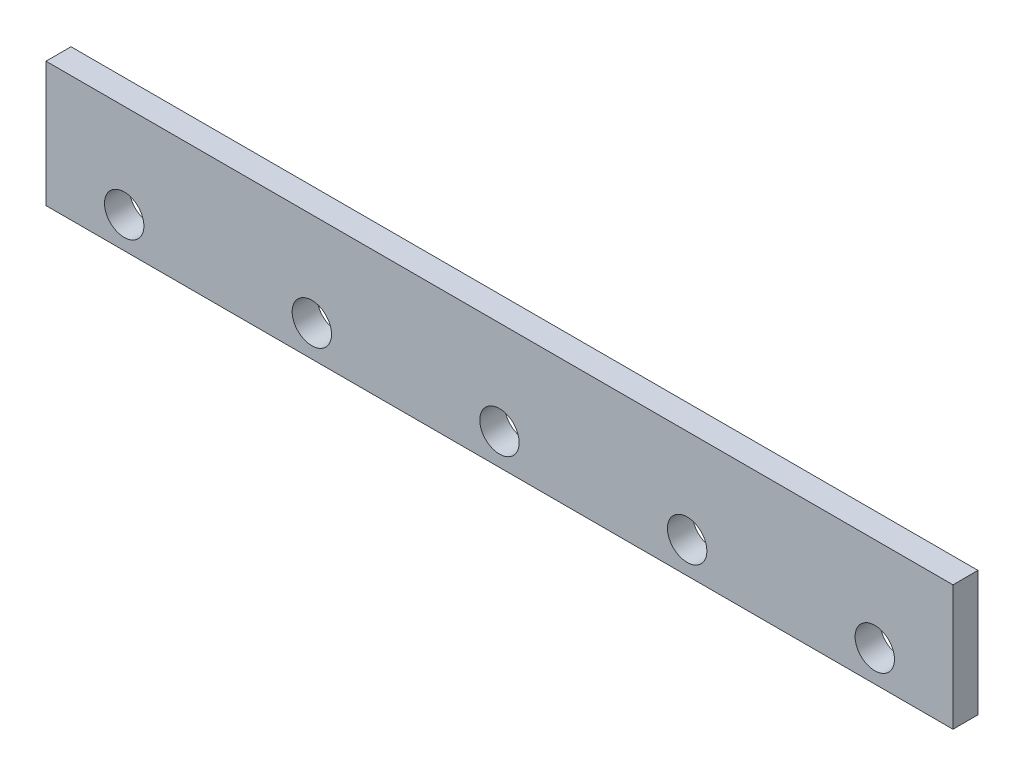
ISO-10303-21;
HEADER;
FILE_DESCRIPTION(('STEP AP214'),'2;1');
FILE_NAME('part.step','',(''),(''),'','','');
FILE_SCHEMA(('AUTOMOTIVE_DESIGN { 1 0 10303 214 1 1 1 1 }'));
ENDSEC;
DATA;
#1=APPLICATION_CONTEXT('core data for automotive mechanical design processes');
#2=APPLICATION_PROTOCOL_DEFINITION('international standard','automotive_design',2000,#1);
#3=PRODUCT_CONTEXT('',#1,'mechanical');
#4=PRODUCT('Part','Part','',(#3));
#5=PRODUCT_RELATED_PRODUCT_CATEGORY('part','',(#4));
#6=PRODUCT_DEFINITION_FORMATION('','',#4);
#7=PRODUCT_DEFINITION_CONTEXT('part definition',#1,'design');
#8=PRODUCT_DEFINITION('design','',#6,#7);
#9=PRODUCT_DEFINITION_SHAPE('','',#8);
#10=(LENGTH_UNIT() NAMED_UNIT(*) SI_UNIT(.MILLI.,.METRE.));
#11=(NAMED_UNIT(*) PLANE_ANGLE_UNIT() SI_UNIT($,.RADIAN.));
#12=(NAMED_UNIT(*) SI_UNIT($,.STERADIAN.) SOLID_ANGLE_UNIT());
#13=UNCERTAINTY_MEASURE_WITH_UNIT(LENGTH_MEASURE(1.E-05),#10,'distance_accuracy_value','');
#14=(GEOMETRIC_REPRESENTATION_CONTEXT(3) GLOBAL_UNCERTAINTY_ASSIGNED_CONTEXT((#13)) GLOBAL_UNIT_ASSIGNED_CONTEXT((#10,
#11,#12)) REPRESENTATION_CONTEXT('',''));
#15=CARTESIAN_POINT('',(0.,0.,0.));
#16=DIRECTION('',(0.,0.,1.));
#17=DIRECTION('',(1.,0.,0.));
#18=AXIS2_PLACEMENT_3D('',#15,#16,#17);
#19=CARTESIAN_POINT('',(530.,20.,-8.));
#20=DIRECTION('',(0.,0.,1.));
#21=DIRECTION('',(1.,0.,0.));
#22=AXIS2_PLACEMENT_3D('',#19,#20,#21);
#23=CYLINDRICAL_SURFACE('',#22,12.6);
#24=CARTESIAN_POINT('',(530.,20.,-8.));
#25=DIRECTION('',(0.,0.,1.));
#26=DIRECTION('',(1.,0.,0.));
#27=AXIS2_PLACEMENT_3D('',#24,#25,#26);
#28=CIRCLE('',#27,12.6);
#29=CARTESIAN_POINT('',(542.6,20.,-8.));
#30=VERTEX_POINT('',#29);
#31=EDGE_CURVE('E42',#30,#30,#28,.T.);
#32=ORIENTED_EDGE('',*,*,#31,.F.);
#33=EDGE_LOOP('',(#32));
#34=FACE_BOUND('',#33,.T.);
#35=CARTESIAN_POINT('',(530.,20.,8.));
#36=DIRECTION('',(0.,0.,1.));
#37=DIRECTION('',(1.,0.,0.));
#38=AXIS2_PLACEMENT_3D('',#35,#36,#37);
#39=CIRCLE('',#38,12.6);
#40=CARTESIAN_POINT('',(542.6,20.,8.));
#41=VERTEX_POINT('',#40);
#42=EDGE_CURVE('E11',#41,#41,#39,.T.);
#43=ORIENTED_EDGE('',*,*,#42,.T.);
#44=EDGE_LOOP('',(#43));
#45=FACE_BOUND('',#44,.T.);
#46=ADVANCED_FACE('F35',(#34,#45),#23,.F.);
#47=CARTESIAN_POINT('',(410.,20.,-8.));
#48=DIRECTION('',(0.,0.,1.));
#49=DIRECTION('',(1.,0.,0.));
#50=AXIS2_PLACEMENT_3D('',#47,#48,#49);
#51=CYLINDRICAL_SURFACE('',#50,12.6);
#52=CARTESIAN_POINT('',(410.,20.,-8.));
#53=DIRECTION('',(0.,0.,1.));
#54=DIRECTION('',(1.,0.,0.));
#55=AXIS2_PLACEMENT_3D('',#52,#53,#54);
#56=CIRCLE('',#55,12.6);
#57=CARTESIAN_POINT('',(422.6,20.,-8.));
#58=VERTEX_POINT('',#57);
#59=EDGE_CURVE('E122',#58,#58,#56,.T.);
#60=ORIENTED_EDGE('',*,*,#59,.F.);
#61=EDGE_LOOP('',(#60));
#62=FACE_BOUND('',#61,.T.);
#63=CARTESIAN_POINT('',(410.,20.,8.));
#64=DIRECTION('',(0.,0.,1.));
#65=DIRECTION('',(1.,0.,0.));
#66=AXIS2_PLACEMENT_3D('',#63,#64,#65);
#67=CIRCLE('',#66,12.6);
#68=CARTESIAN_POINT('',(422.6,20.,8.));
#69=VERTEX_POINT('',#68);
#70=EDGE_CURVE('E125',#69,#69,#67,.T.);
#71=ORIENTED_EDGE('',*,*,#70,.T.);
#72=EDGE_LOOP('',(#71));
#73=FACE_BOUND('',#72,.T.);
#74=ADVANCED_FACE('F134',(#62,#73),#51,.F.);
#75=CARTESIAN_POINT('',(290.,20.,-8.));
#76=DIRECTION('',(0.,0.,1.));
#77=DIRECTION('',(1.,0.,0.));
#78=AXIS2_PLACEMENT_3D('',#75,#76,#77);
#79=CYLINDRICAL_SURFACE('',#78,12.6);
#80=CARTESIAN_POINT('',(290.,20.,-8.));
#81=DIRECTION('',(0.,0.,1.));
#82=DIRECTION('',(1.,0.,0.));
#83=AXIS2_PLACEMENT_3D('',#80,#81,#82);
#84=CIRCLE('',#83,12.6);
#85=CARTESIAN_POINT('',(302.6,20.,-8.));
#86=VERTEX_POINT('',#85);
#87=EDGE_CURVE('E114',#86,#86,#84,.T.);
#88=ORIENTED_EDGE('',*,*,#87,.F.);
#89=EDGE_LOOP('',(#88));
#90=FACE_BOUND('',#89,.T.);
#91=CARTESIAN_POINT('',(290.,20.,8.));
#92=DIRECTION('',(0.,0.,1.));
#93=DIRECTION('',(1.,0.,0.));
#94=AXIS2_PLACEMENT_3D('',#91,#92,#93);
#95=CIRCLE('',#94,12.6);
#96=CARTESIAN_POINT('',(302.6,20.,8.));
#97=VERTEX_POINT('',#96);
#98=EDGE_CURVE('E119',#97,#97,#95,.T.);
#99=ORIENTED_EDGE('',*,*,#98,.T.);
#100=EDGE_LOOP('',(#99));
#101=FACE_BOUND('',#100,.T.);
#102=ADVANCED_FACE('F165',(#90,#101),#79,.F.);
#103=CARTESIAN_POINT('',(0.,80.,-8.));
#104=DIRECTION('',(-1.,0.,0.));
#105=DIRECTION('',(0.,0.,1.));
#106=AXIS2_PLACEMENT_3D('',#103,#104,#105);
#107=PLANE('',#106);
#108=DIRECTION('',(0.,0.,1.));
#109=VECTOR('',#108,1.);
#110=CARTESIAN_POINT('',(0.,0.,-8.));
#111=LINE('',#110,#109);
#112=CARTESIAN_POINT('',(0.,0.,-8.));
#113=VERTEX_POINT('',#112);
#114=CARTESIAN_POINT('',(0.,0.,8.));
#115=VERTEX_POINT('',#114);
#116=EDGE_CURVE('E74',#113,#115,#111,.T.);
#117=ORIENTED_EDGE('',*,*,#116,.T.);
#118=DIRECTION('',(0.,-1.,0.));
#119=VECTOR('',#118,1.);
#120=CARTESIAN_POINT('',(0.,80.,8.));
#121=LINE('',#120,#119);
#122=CARTESIAN_POINT('',(0.,80.,8.));
#123=VERTEX_POINT('',#122);
#124=EDGE_CURVE('E78',#123,#115,#121,.T.);
#125=ORIENTED_EDGE('',*,*,#124,.F.);
#126=DIRECTION('',(0.,0.,1.));
#127=VECTOR('',#126,1.);
#128=CARTESIAN_POINT('',(0.,80.,-8.));
#129=LINE('',#128,#127);
#130=CARTESIAN_POINT('',(0.,80.,-8.));
#131=VERTEX_POINT('',#130);
#132=EDGE_CURVE('E49',#131,#123,#129,.T.);
#133=ORIENTED_EDGE('',*,*,#132,.F.);
#134=DIRECTION('',(0.,-1.,0.));
#135=VECTOR('',#134,1.);
#136=CARTESIAN_POINT('',(0.,80.,-8.));
#137=LINE('',#136,#135);
#138=EDGE_CURVE('E79',#131,#113,#137,.T.);
#139=ORIENTED_EDGE('',*,*,#138,.T.);
#140=EDGE_LOOP('',(#117,#125,#133,#139));
#141=FACE_BOUND('',#140,.T.);
#142=ADVANCED_FACE('F76',(#141),#107,.T.);
#143=CARTESIAN_POINT('',(580.,80.,-8.));
#144=DIRECTION('',(0.,1.,0.));
#145=DIRECTION('',(0.,0.,1.));
#146=AXIS2_PLACEMENT_3D('',#143,#144,#145);
#147=PLANE('',#146);
#148=ORIENTED_EDGE('',*,*,#132,.T.);
#149=DIRECTION('',(-1.,0.,0.));
#150=VECTOR('',#149,1.);
#151=CARTESIAN_POINT('',(580.,80.,8.));
#152=LINE('',#151,#150);
#153=CARTESIAN_POINT('',(580.,80.,8.));
#154=VERTEX_POINT('',#153);
#155=EDGE_CURVE('E97',#154,#123,#152,.T.);
#156=ORIENTED_EDGE('',*,*,#155,.F.);
#157=DIRECTION('',(0.,0.,1.));
#158=VECTOR('',#157,1.);
#159=CARTESIAN_POINT('',(580.,80.,-8.));
#160=LINE('',#159,#158);
#161=CARTESIAN_POINT('',(580.,80.,-8.));
#162=VERTEX_POINT('',#161);
#163=EDGE_CURVE('E57',#162,#154,#160,.T.);
#164=ORIENTED_EDGE('',*,*,#163,.F.);
#165=DIRECTION('',(-1.,0.,0.));
#166=VECTOR('',#165,1.);
#167=CARTESIAN_POINT('',(580.,80.,-8.));
#168=LINE('',#167,#166);
#169=EDGE_CURVE('E84',#162,#131,#168,.T.);
#170=ORIENTED_EDGE('',*,*,#169,.T.);
#171=EDGE_LOOP('',(#148,#156,#164,#170));
#172=FACE_BOUND('',#171,.T.);
#173=ADVANCED_FACE('F154',(#172),#147,.T.);
#174=CARTESIAN_POINT('',(580.,0.,-8.));
#175=DIRECTION('',(1.,0.,0.));
#176=DIRECTION('',(0.,0.,-1.));
#177=AXIS2_PLACEMENT_3D('',#174,#175,#176);
#178=PLANE('',#177);
#179=ORIENTED_EDGE('',*,*,#163,.T.);
#180=DIRECTION('',(0.,1.,0.));
#181=VECTOR('',#180,1.);
#182=CARTESIAN_POINT('',(580.,0.,8.));
#183=LINE('',#182,#181);
#184=CARTESIAN_POINT('',(580.,0.,8.));
#185=VERTEX_POINT('',#184);
#186=EDGE_CURVE('E92',#185,#154,#183,.T.);
#187=ORIENTED_EDGE('',*,*,#186,.F.);
#188=DIRECTION('',(0.,0.,1.));
#189=VECTOR('',#188,1.);
#190=CARTESIAN_POINT('',(580.,0.,-8.));
#191=LINE('',#190,#189);
#192=CARTESIAN_POINT('',(580.,0.,-8.));
#193=VERTEX_POINT('',#192);
#194=EDGE_CURVE('E83',#193,#185,#191,.T.);
#195=ORIENTED_EDGE('',*,*,#194,.F.);
#196=DIRECTION('',(0.,1.,0.));
#197=VECTOR('',#196,1.);
#198=CARTESIAN_POINT('',(580.,0.,-8.));
#199=LINE('',#198,#197);
#200=EDGE_CURVE('E110',#193,#162,#199,.T.);
#201=ORIENTED_EDGE('',*,*,#200,.T.);
#202=EDGE_LOOP('',(#179,#187,#195,#201));
#203=FACE_BOUND('',#202,.T.);
#204=ADVANCED_FACE('F157',(#203),#178,.T.);
#205=CARTESIAN_POINT('',(0.,0.,-8.));
#206=DIRECTION('',(0.,-1.,0.));
#207=DIRECTION('',(0.,0.,-1.));
#208=AXIS2_PLACEMENT_3D('',#205,#206,#207);
#209=PLANE('',#208);
#210=ORIENTED_EDGE('',*,*,#194,.T.);
#211=DIRECTION('',(1.,0.,0.));
#212=VECTOR('',#211,1.);
#213=CARTESIAN_POINT('',(0.,0.,8.));
#214=LINE('',#213,#212);
#215=EDGE_CURVE('E87',#115,#185,#214,.T.);
#216=ORIENTED_EDGE('',*,*,#215,.F.);
#217=ORIENTED_EDGE('',*,*,#116,.F.);
#218=DIRECTION('',(1.,0.,0.));
#219=VECTOR('',#218,1.);
#220=CARTESIAN_POINT('',(0.,0.,-8.));
#221=LINE('',#220,#219);
#222=EDGE_CURVE('E108',#113,#193,#221,.T.);
#223=ORIENTED_EDGE('',*,*,#222,.T.);
#224=EDGE_LOOP('',(#210,#216,#217,#223));
#225=FACE_BOUND('',#224,.T.);
#226=ADVANCED_FACE('F88',(#225),#209,.T.);
#227=CARTESIAN_POINT('',(0.,0.,-8.));
#228=DIRECTION('',(0.,0.,1.));
#229=DIRECTION('',(1.,0.,0.));
#230=AXIS2_PLACEMENT_3D('',#227,#228,#229);
#231=PLANE('',#230);
#232=CARTESIAN_POINT('',(170.,20.,-8.));
#233=DIRECTION('',(0.,0.,1.));
#234=DIRECTION('',(1.,0.,0.));
#235=AXIS2_PLACEMENT_3D('',#232,#233,#234);
#236=CIRCLE('',#235,12.6);
#237=CARTESIAN_POINT('',(182.6,20.,-8.));
#238=VERTEX_POINT('',#237);
#239=EDGE_CURVE('E238',#238,#238,#236,.T.);
#240=ORIENTED_EDGE('',*,*,#239,.T.);
#241=EDGE_LOOP('',(#240));
#242=FACE_BOUND('',#241,.T.);
#243=CARTESIAN_POINT('',(50.,20.,-8.));
#244=DIRECTION('',(0.,0.,1.));
#245=DIRECTION('',(1.,0.,0.));
#246=AXIS2_PLACEMENT_3D('',#243,#244,#245);
#247=CIRCLE('',#246,12.6);
#248=CARTESIAN_POINT('',(62.6,20.,-8.));
#249=VERTEX_POINT('',#248);
#250=EDGE_CURVE('E98',#249,#249,#247,.T.);
#251=ORIENTED_EDGE('',*,*,#250,.T.);
#252=EDGE_LOOP('',(#251));
#253=FACE_BOUND('',#252,.T.);
#254=ORIENTED_EDGE('',*,*,#138,.F.);
#255=ORIENTED_EDGE('',*,*,#169,.F.);
#256=ORIENTED_EDGE('',*,*,#200,.F.);
#257=ORIENTED_EDGE('',*,*,#222,.F.);
#258=EDGE_LOOP('',(#254,#255,#256,#257));
#259=FACE_BOUND('',#258,.T.);
#260=ORIENTED_EDGE('',*,*,#87,.T.);
#261=EDGE_LOOP('',(#260));
#262=FACE_BOUND('',#261,.T.);
#263=ORIENTED_EDGE('',*,*,#59,.T.);
#264=EDGE_LOOP('',(#263));
#265=FACE_BOUND('',#264,.T.);
#266=ORIENTED_EDGE('',*,*,#31,.T.);
#267=EDGE_LOOP('',(#266));
#268=FACE_BOUND('',#267,.T.);
#269=ADVANCED_FACE('F130',(#242,#253,#259,#262,#265,#268),#231,.F.);
#270=CARTESIAN_POINT('',(0.,0.,8.));
#271=DIRECTION('',(0.,0.,1.));
#272=DIRECTION('',(1.,0.,0.));
#273=AXIS2_PLACEMENT_3D('',#270,#271,#272);
#274=PLANE('',#273);
#275=CARTESIAN_POINT('',(170.,20.,8.));
#276=DIRECTION('',(0.,0.,1.));
#277=DIRECTION('',(1.,0.,0.));
#278=AXIS2_PLACEMENT_3D('',#275,#276,#277);
#279=CIRCLE('',#278,12.6);
#280=CARTESIAN_POINT('',(182.6,20.,8.));
#281=VERTEX_POINT('',#280);
#282=EDGE_CURVE('E240',#281,#281,#279,.T.);
#283=ORIENTED_EDGE('',*,*,#282,.F.);
#284=EDGE_LOOP('',(#283));
#285=FACE_BOUND('',#284,.T.);
#286=CARTESIAN_POINT('',(50.,20.,8.));
#287=DIRECTION('',(0.,0.,1.));
#288=DIRECTION('',(1.,0.,0.));
#289=AXIS2_PLACEMENT_3D('',#286,#287,#288);
#290=CIRCLE('',#289,12.6);
#291=CARTESIAN_POINT('',(62.6,20.,8.));
#292=VERTEX_POINT('',#291);
#293=EDGE_CURVE('E101',#292,#292,#290,.T.);
#294=ORIENTED_EDGE('',*,*,#293,.F.);
#295=EDGE_LOOP('',(#294));
#296=FACE_BOUND('',#295,.T.);
#297=ORIENTED_EDGE('',*,*,#124,.T.);
#298=ORIENTED_EDGE('',*,*,#215,.T.);
#299=ORIENTED_EDGE('',*,*,#186,.T.);
#300=ORIENTED_EDGE('',*,*,#155,.T.);
#301=EDGE_LOOP('',(#297,#298,#299,#300));
#302=FACE_BOUND('',#301,.T.);
#303=ORIENTED_EDGE('',*,*,#98,.F.);
#304=EDGE_LOOP('',(#303));
#305=FACE_BOUND('',#304,.T.);
#306=ORIENTED_EDGE('',*,*,#70,.F.);
#307=EDGE_LOOP('',(#306));
#308=FACE_BOUND('',#307,.T.);
#309=ORIENTED_EDGE('',*,*,#42,.F.);
#310=EDGE_LOOP('',(#309));
#311=FACE_BOUND('',#310,.T.);
#312=ADVANCED_FACE('F95',(#285,#296,#302,#305,#308,#311),#274,.T.);
#313=CARTESIAN_POINT('',(50.,20.,-8.));
#314=DIRECTION('',(0.,0.,1.));
#315=DIRECTION('',(1.,0.,0.));
#316=AXIS2_PLACEMENT_3D('',#313,#314,#315);
#317=CYLINDRICAL_SURFACE('',#316,12.6);
#318=ORIENTED_EDGE('',*,*,#250,.F.);
#319=EDGE_LOOP('',(#318));
#320=FACE_BOUND('',#319,.T.);
#321=ORIENTED_EDGE('',*,*,#293,.T.);
#322=EDGE_LOOP('',(#321));
#323=FACE_BOUND('',#322,.T.);
#324=ADVANCED_FACE('F138',(#320,#323),#317,.F.);
#325=CARTESIAN_POINT('',(170.,20.,-8.));
#326=DIRECTION('',(0.,0.,1.));
#327=DIRECTION('',(1.,0.,0.));
#328=AXIS2_PLACEMENT_3D('',#325,#326,#327);
#329=CYLINDRICAL_SURFACE('',#328,12.6);
#330=ORIENTED_EDGE('',*,*,#239,.F.);
#331=EDGE_LOOP('',(#330));
#332=FACE_BOUND('',#331,.T.);
#333=ORIENTED_EDGE('',*,*,#282,.T.);
#334=EDGE_LOOP('',(#333));
#335=FACE_BOUND('',#334,.T.);
#336=ADVANCED_FACE('F145',(#332,#335),#329,.F.);
#337=CLOSED_SHELL('',(#46,#74,#102,#142,#173,#204,#226,#269,#312,#324,#336));
#338=MANIFOLD_SOLID_BREP('B2',#337);
#339=ADVANCED_BREP_SHAPE_REPRESENTATION('',(#18,#338),#14);
#340=SHAPE_DEFINITION_REPRESENTATION(#9,#339);
ENDSEC;
END-ISO-10303-21;
